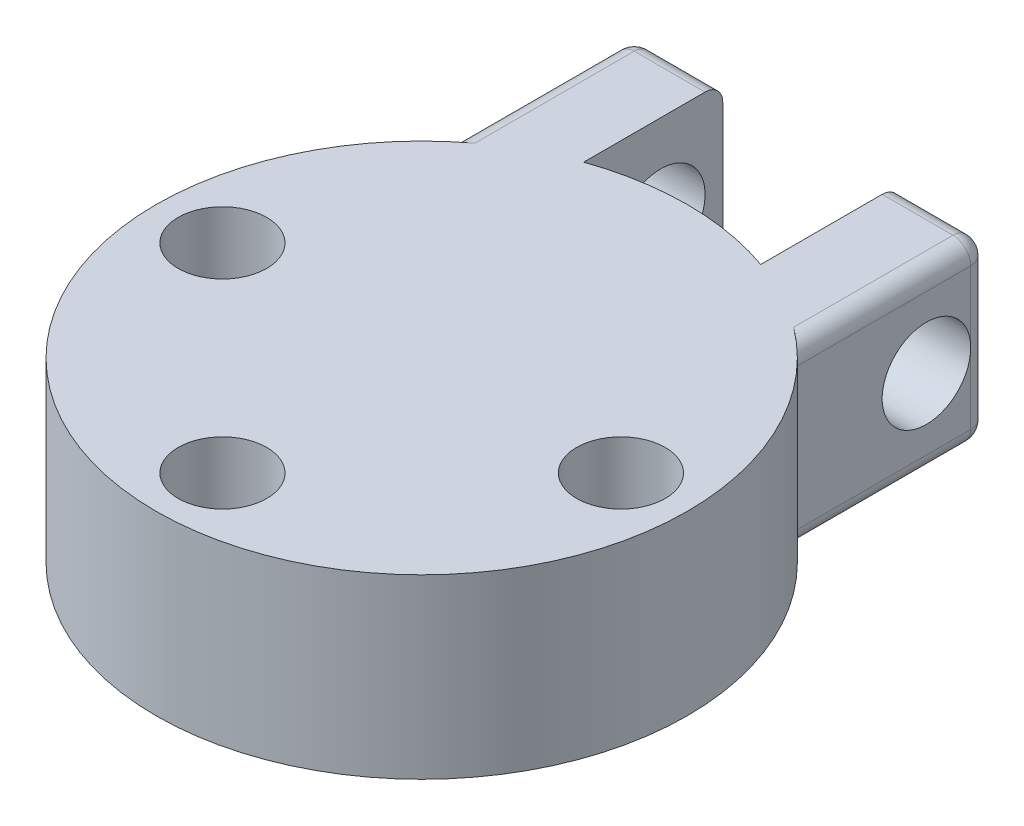
ISO-10303-21;
HEADER;
FILE_DESCRIPTION(('STEP AP214'),'2;1');
FILE_NAME('part.step','',(''),(''),'','','');
FILE_SCHEMA(('AUTOMOTIVE_DESIGN { 1 0 10303 214 1 1 1 1 }'));
ENDSEC;
DATA;
#1=APPLICATION_CONTEXT('core data for automotive mechanical design processes');
#2=APPLICATION_PROTOCOL_DEFINITION('international standard','automotive_design',2000,#1);
#3=PRODUCT_CONTEXT('',#1,'mechanical');
#4=PRODUCT('Part','Part','',(#3));
#5=PRODUCT_RELATED_PRODUCT_CATEGORY('part','',(#4));
#6=PRODUCT_DEFINITION_FORMATION('','',#4);
#7=PRODUCT_DEFINITION_CONTEXT('part definition',#1,'design');
#8=PRODUCT_DEFINITION('design','',#6,#7);
#9=PRODUCT_DEFINITION_SHAPE('','',#8);
#10=(LENGTH_UNIT() NAMED_UNIT(*) SI_UNIT(.MILLI.,.METRE.));
#11=(NAMED_UNIT(*) PLANE_ANGLE_UNIT() SI_UNIT($,.RADIAN.));
#12=(NAMED_UNIT(*) SI_UNIT($,.STERADIAN.) SOLID_ANGLE_UNIT());
#13=UNCERTAINTY_MEASURE_WITH_UNIT(LENGTH_MEASURE(1.E-05),#10,'distance_accuracy_value','');
#14=(GEOMETRIC_REPRESENTATION_CONTEXT(3) GLOBAL_UNCERTAINTY_ASSIGNED_CONTEXT((#13)) GLOBAL_UNIT_ASSIGNED_CONTEXT((#10,
#11,#12)) REPRESENTATION_CONTEXT('',''));
#15=CARTESIAN_POINT('',(0.,0.,0.));
#16=DIRECTION('',(0.,0.,1.));
#17=DIRECTION('',(1.,0.,0.));
#18=AXIS2_PLACEMENT_3D('',#15,#16,#17);
#19=CARTESIAN_POINT('',(0.,0.,0.));
#20=DIRECTION('',(0.,1.,0.));
#21=DIRECTION('',(0.,0.,1.));
#22=AXIS2_PLACEMENT_3D('',#19,#20,#21);
#23=PLANE('',#22);
#24=CARTESIAN_POINT('',(11.25,0.,0.));
#25=DIRECTION('',(0.,-1.,0.));
#26=DIRECTION('',(0.,0.,-1.));
#27=AXIS2_PLACEMENT_3D('',#24,#25,#26);
#28=CIRCLE('',#27,2.5);
#29=CARTESIAN_POINT('',(11.25,0.,-2.5));
#30=VERTEX_POINT('',#29);
#31=EDGE_CURVE('E771',#30,#30,#28,.T.);
#32=ORIENTED_EDGE('',*,*,#31,.F.);
#33=EDGE_LOOP('',(#32));
#34=FACE_BOUND('',#33,.T.);
#35=CARTESIAN_POINT('',(0.,0.,11.25));
#36=DIRECTION('',(0.,-1.,0.));
#37=DIRECTION('',(0.,0.,-1.));
#38=AXIS2_PLACEMENT_3D('',#35,#36,#37);
#39=CIRCLE('',#38,2.5);
#40=CARTESIAN_POINT('',(0.,0.,8.75));
#41=VERTEX_POINT('',#40);
#42=EDGE_CURVE('E773',#41,#41,#39,.T.);
#43=ORIENTED_EDGE('',*,*,#42,.F.);
#44=EDGE_LOOP('',(#43));
#45=FACE_BOUND('',#44,.T.);
#46=DIRECTION('',(0.,0.,-1.));
#47=VECTOR('',#46,1.);
#48=CARTESIAN_POINT('',(9.,0.,0.));
#49=LINE('',#48,#47);
#50=CARTESIAN_POINT('',(9.,0.,-21.));
#51=VERTEX_POINT('',#50);
#52=CARTESIAN_POINT('',(9.,0.,-12.));
#53=VERTEX_POINT('',#52);
#54=EDGE_CURVE('E490',#51,#53,#49,.F.);
#55=ORIENTED_EDGE('',*,*,#54,.T.);
#56=CARTESIAN_POINT('',(0.,0.,0.));
#57=DIRECTION('',(0.,1.,0.));
#58=DIRECTION('',(0.,0.,1.));
#59=AXIS2_PLACEMENT_3D('',#56,#57,#58);
#60=CIRCLE('',#59,15.);
#61=CARTESIAN_POINT('',(-9.,0.,-12.));
#62=VERTEX_POINT('',#61);
#63=EDGE_CURVE('E196',#62,#53,#60,.T.);
#64=ORIENTED_EDGE('',*,*,#63,.F.);
#65=DIRECTION('',(0.,0.,1.));
#66=VECTOR('',#65,1.);
#67=CARTESIAN_POINT('',(-9.,0.,0.));
#68=LINE('',#67,#66);
#69=CARTESIAN_POINT('',(-9.,0.,-21.));
#70=VERTEX_POINT('',#69);
#71=EDGE_CURVE('E482',#62,#70,#68,.F.);
#72=ORIENTED_EDGE('',*,*,#71,.T.);
#73=DIRECTION('',(-1.,0.,0.));
#74=VECTOR('',#73,1.);
#75=CARTESIAN_POINT('',(0.,0.,-21.));
#76=LINE('',#75,#74);
#77=CARTESIAN_POINT('',(-5.,0.,-21.));
#78=VERTEX_POINT('',#77);
#79=EDGE_CURVE('E485',#70,#78,#76,.F.);
#80=ORIENTED_EDGE('',*,*,#79,.T.);
#81=DIRECTION('',(0.,0.,-1.));
#82=VECTOR('',#81,1.);
#83=CARTESIAN_POINT('',(-5.,0.,-14.142135623731));
#84=LINE('',#83,#82);
#85=CARTESIAN_POINT('',(-5.,0.,-5.59016994374947));
#86=VERTEX_POINT('',#85);
#87=EDGE_CURVE('E210',#86,#78,#84,.T.);
#88=ORIENTED_EDGE('',*,*,#87,.F.);
#89=CARTESIAN_POINT('',(0.,0.,0.));
#90=DIRECTION('',(0.,-1.,0.));
#91=DIRECTION('',(0.,0.,-1.));
#92=AXIS2_PLACEMENT_3D('',#89,#90,#91);
#93=CIRCLE('',#92,7.5);
#94=CARTESIAN_POINT('',(5.,0.,-5.59016994374947));
#95=VERTEX_POINT('',#94);
#96=EDGE_CURVE('E200',#95,#86,#93,.T.);
#97=ORIENTED_EDGE('',*,*,#96,.F.);
#98=DIRECTION('',(0.,0.,1.));
#99=VECTOR('',#98,1.);
#100=CARTESIAN_POINT('',(5.,0.,-14.142135623731));
#101=LINE('',#100,#99);
#102=CARTESIAN_POINT('',(5.,0.,-21.));
#103=VERTEX_POINT('',#102);
#104=EDGE_CURVE('E183',#103,#95,#101,.T.);
#105=ORIENTED_EDGE('',*,*,#104,.F.);
#106=DIRECTION('',(-1.,0.,0.));
#107=VECTOR('',#106,1.);
#108=CARTESIAN_POINT('',(0.,0.,-21.));
#109=LINE('',#108,#107);
#110=EDGE_CURVE('E488',#103,#51,#109,.F.);
#111=ORIENTED_EDGE('',*,*,#110,.T.);
#112=EDGE_LOOP('',(#55,#64,#72,#80,#88,#97,#105,#111));
#113=FACE_BOUND('',#112,.T.);
#114=CARTESIAN_POINT('',(-11.25,0.,0.));
#115=DIRECTION('',(0.,-1.,0.));
#116=DIRECTION('',(0.,0.,-1.));
#117=AXIS2_PLACEMENT_3D('',#114,#115,#116);
#118=CIRCLE('',#117,2.5);
#119=CARTESIAN_POINT('',(-11.25,0.,-2.5));
#120=VERTEX_POINT('',#119);
#121=EDGE_CURVE('E780',#120,#120,#118,.T.);
#122=ORIENTED_EDGE('',*,*,#121,.F.);
#123=EDGE_LOOP('',(#122));
#124=FACE_BOUND('',#123,.T.);
#125=ADVANCED_FACE('F41',(#34,#45,#113,#124),#23,.F.);
#126=CARTESIAN_POINT('',(0.,10.,0.));
#127=DIRECTION('',(0.,-1.,0.));
#128=DIRECTION('',(0.,0.,-1.));
#129=AXIS2_PLACEMENT_3D('',#126,#127,#128);
#130=CYLINDRICAL_SURFACE('',#129,15.);
#131=DIRECTION('',(0.,-1.,0.));
#132=VECTOR('',#131,1.);
#133=CARTESIAN_POINT('',(5.,10.,-14.142135623731));
#134=LINE('',#133,#132);
#135=CARTESIAN_POINT('',(5.,10.,-14.142135623731));
#136=VERTEX_POINT('',#135);
#137=CARTESIAN_POINT('',(5.,9.5,-14.142135623731));
#138=VERTEX_POINT('',#137);
#139=EDGE_CURVE('E249',#136,#138,#134,.T.);
#140=ORIENTED_EDGE('',*,*,#139,.T.);
#141=CARTESIAN_POINT('',(0.,9.5,0.));
#142=DIRECTION('',(0.,1.,0.));
#143=DIRECTION('',(0.,0.,1.));
#144=AXIS2_PLACEMENT_3D('',#141,#142,#143);
#145=CIRCLE('',#144,15.);
#146=CARTESIAN_POINT('',(-5.,9.5,-14.142135623731));
#147=VERTEX_POINT('',#146);
#148=EDGE_CURVE('E268',#138,#147,#145,.T.);
#149=ORIENTED_EDGE('',*,*,#148,.T.);
#150=DIRECTION('',(0.,-1.,0.));
#151=VECTOR('',#150,1.);
#152=CARTESIAN_POINT('',(-5.,10.,-14.142135623731));
#153=LINE('',#152,#151);
#154=CARTESIAN_POINT('',(-5.,10.,-14.142135623731));
#155=VERTEX_POINT('',#154);
#156=EDGE_CURVE('E265',#155,#147,#153,.T.);
#157=ORIENTED_EDGE('',*,*,#156,.F.);
#158=CARTESIAN_POINT('',(0.,10.,0.));
#159=DIRECTION('',(0.,1.,0.));
#160=DIRECTION('',(0.,0.,1.));
#161=AXIS2_PLACEMENT_3D('',#158,#159,#160);
#162=CIRCLE('',#161,15.);
#163=EDGE_CURVE('E195',#136,#155,#162,.T.);
#164=ORIENTED_EDGE('',*,*,#163,.F.);
#165=EDGE_LOOP('',(#140,#149,#157,#164));
#166=FACE_BOUND('',#165,.T.);
#167=ADVANCED_FACE('F303',(#166),#130,.T.);
#168=CARTESIAN_POINT('',(-5.,10.,-14.142135623731));
#169=DIRECTION('',(-1.,0.,0.));
#170=DIRECTION('',(0.,0.,1.));
#171=AXIS2_PLACEMENT_3D('',#168,#169,#170);
#172=PLANE('',#171);
#173=CARTESIAN_POINT('',(-5.,5.,-18.5));
#174=DIRECTION('',(-1.,0.,0.));
#175=DIRECTION('',(0.,0.,1.));
#176=AXIS2_PLACEMENT_3D('',#173,#174,#175);
#177=CIRCLE('',#176,2.5);
#178=CARTESIAN_POINT('',(-5.,5.,-16.));
#179=VERTEX_POINT('',#178);
#180=EDGE_CURVE('E237',#179,#179,#177,.T.);
#181=ORIENTED_EDGE('',*,*,#180,.T.);
#182=EDGE_LOOP('',(#181));
#183=FACE_BOUND('',#182,.T.);
#184=ORIENTED_EDGE('',*,*,#87,.T.);
#185=CARTESIAN_POINT('',(-5.,0.999999999999999,-21.));
#186=DIRECTION('',(-1.,0.,0.));
#187=DIRECTION('',(0.,0.,1.));
#188=AXIS2_PLACEMENT_3D('',#185,#186,#187);
#189=CIRCLE('',#188,1.);
#190=CARTESIAN_POINT('',(-5.,0.999999999999999,-22.));
#191=VERTEX_POINT('',#190);
#192=EDGE_CURVE('E471',#78,#191,#189,.F.);
#193=ORIENTED_EDGE('',*,*,#192,.T.);
#194=DIRECTION('',(0.,-1.,0.));
#195=VECTOR('',#194,1.);
#196=CARTESIAN_POINT('',(-5.,10.,-22.));
#197=LINE('',#196,#195);
#198=CARTESIAN_POINT('',(-5.,9.,-22.));
#199=VERTEX_POINT('',#198);
#200=EDGE_CURVE('E262',#199,#191,#197,.T.);
#201=ORIENTED_EDGE('',*,*,#200,.F.);
#202=CARTESIAN_POINT('',(-5.,9.,-21.));
#203=DIRECTION('',(-1.,0.,0.));
#204=DIRECTION('',(0.,0.,1.));
#205=AXIS2_PLACEMENT_3D('',#202,#203,#204);
#206=CIRCLE('',#205,1.);
#207=CARTESIAN_POINT('',(-5.,10.,-21.));
#208=VERTEX_POINT('',#207);
#209=EDGE_CURVE('E514',#199,#208,#206,.F.);
#210=ORIENTED_EDGE('',*,*,#209,.T.);
#211=DIRECTION('',(0.,0.,-1.));
#212=VECTOR('',#211,1.);
#213=CARTESIAN_POINT('',(-5.,10.,-14.142135623731));
#214=LINE('',#213,#212);
#215=EDGE_CURVE('E242',#155,#208,#214,.T.);
#216=ORIENTED_EDGE('',*,*,#215,.F.);
#217=ORIENTED_EDGE('',*,*,#156,.T.);
#218=CARTESIAN_POINT('',(-5.,9.5,-14.142135623731));
#219=CARTESIAN_POINT('',(-5.,9.3324654449293,-13.9644362529883));
#220=CARTESIAN_POINT('',(-5.,9.16511441299039,-13.7865636565365));
#221=CARTESIAN_POINT('',(-5.,8.83082894329499,-13.4304297689544));
#222=CARTESIAN_POINT('',(-5.,8.66389450267688,-13.2521684805099));
#223=CARTESIAN_POINT('',(-5.,8.33048922486681,-12.895212273305));
#224=CARTESIAN_POINT('',(-5.,8.16401838831296,-12.7165173539483));
#225=CARTESIAN_POINT('',(-5.,7.83160064461413,-12.3586386171312));
#226=CARTESIAN_POINT('',(-5.,7.66565374108889,-12.1794547963089));
#227=CARTESIAN_POINT('',(-5.,7.5,-12.));
#228=B_SPLINE_CURVE_WITH_KNOTS('',3,(#218,#219,#220,#221,#222,#223,#224,#225,#226,#227),
.UNSPECIFIED.,.F.,.F.,(4,2,2,2,4),(0.,0.732669199428463,1.4653333521281,2.19799851277881,
2.9306687242239),.UNSPECIFIED.);
#229=CARTESIAN_POINT('',(-5.,7.5,-12.));
#230=VERTEX_POINT('',#229);
#231=EDGE_CURVE('E275',#147,#230,#228,.T.);
#232=ORIENTED_EDGE('',*,*,#231,.T.);
#233=DIRECTION('',(0.,0.,-1.));
#234=VECTOR('',#233,1.);
#235=CARTESIAN_POINT('',(-5.,7.5,-2.));
#236=LINE('',#235,#234);
#237=CARTESIAN_POINT('',(-5.,7.5,-5.59016994374948));
#238=VERTEX_POINT('',#237);
#239=EDGE_CURVE('E222',#238,#230,#236,.T.);
#240=ORIENTED_EDGE('',*,*,#239,.F.);
#241=DIRECTION('',(0.,-1.,0.));
#242=VECTOR('',#241,1.);
#243=CARTESIAN_POINT('',(-5.,28.7132034355964,-5.59016994374947));
#244=LINE('',#243,#242);
#245=EDGE_CURVE('E204',#238,#86,#244,.T.);
#246=ORIENTED_EDGE('',*,*,#245,.T.);
#247=EDGE_LOOP('',(#184,#193,#201,#210,#216,#217,#232,#240,#246));
#248=FACE_BOUND('',#247,.T.);
#249=ADVANCED_FACE('F290',(#183,#248),#172,.F.);
#250=CARTESIAN_POINT('',(-5.,10.,-22.));
#251=DIRECTION('',(0.,0.,1.));
#252=DIRECTION('',(1.,0.,0.));
#253=AXIS2_PLACEMENT_3D('',#250,#251,#252);
#254=PLANE('',#253);
#255=ORIENTED_EDGE('',*,*,#200,.T.);
#256=DIRECTION('',(-1.,0.,0.));
#257=VECTOR('',#256,1.);
#258=CARTESIAN_POINT('',(-5.,0.999999999999999,-22.));
#259=LINE('',#258,#257);
#260=CARTESIAN_POINT('',(-9.,0.999999999999999,-22.));
#261=VERTEX_POINT('',#260);
#262=EDGE_CURVE('E512',#191,#261,#259,.T.);
#263=ORIENTED_EDGE('',*,*,#262,.T.);
#264=DIRECTION('',(0.,-1.,0.));
#265=VECTOR('',#264,1.);
#266=CARTESIAN_POINT('',(-9.,10.,-22.));
#267=LINE('',#266,#265);
#268=CARTESIAN_POINT('',(-9.,9.,-22.));
#269=VERTEX_POINT('',#268);
#270=EDGE_CURVE('E464',#261,#269,#267,.F.);
#271=ORIENTED_EDGE('',*,*,#270,.T.);
#272=DIRECTION('',(-1.,0.,0.));
#273=VECTOR('',#272,1.);
#274=CARTESIAN_POINT('',(-5.,9.,-22.));
#275=LINE('',#274,#273);
#276=EDGE_CURVE('E509',#269,#199,#275,.F.);
#277=ORIENTED_EDGE('',*,*,#276,.T.);
#278=EDGE_LOOP('',(#255,#263,#271,#277));
#279=FACE_BOUND('',#278,.T.);
#280=ADVANCED_FACE('F519',(#279),#254,.F.);
#281=CARTESIAN_POINT('',(-10.,10.,-22.));
#282=DIRECTION('',(1.,0.,0.));
#283=DIRECTION('',(0.,0.,-1.));
#284=AXIS2_PLACEMENT_3D('',#281,#282,#283);
#285=PLANE('',#284);
#286=DIRECTION('',(0.,-1.,0.));
#287=VECTOR('',#286,1.);
#288=CARTESIAN_POINT('',(-10.,10.,-21.));
#289=LINE('',#288,#287);
#290=CARTESIAN_POINT('',(-10.,4.64556382803104,-21.));
#291=VERTEX_POINT('',#290);
#292=CARTESIAN_POINT('',(-10.,0.999999999999999,-21.));
#293=VERTEX_POINT('',#292);
#294=EDGE_CURVE('E58',#291,#293,#289,.T.);
#295=ORIENTED_EDGE('',*,*,#294,.T.);
#296=DIRECTION('',(0.,0.,1.));
#297=VECTOR('',#296,1.);
#298=CARTESIAN_POINT('',(-10.,0.999999999999999,-22.));
#299=LINE('',#298,#297);
#300=CARTESIAN_POINT('',(-10.,0.999999999999999,-11.1803398874989));
#301=VERTEX_POINT('',#300);
#302=EDGE_CURVE('E469',#293,#301,#299,.T.);
#303=ORIENTED_EDGE('',*,*,#302,.T.);
#304=DIRECTION('',(0.,-1.,0.));
#305=VECTOR('',#304,1.);
#306=CARTESIAN_POINT('',(-10.,10.,-11.1803398874989));
#307=LINE('',#306,#305);
#308=CARTESIAN_POINT('',(-10.,9.,-11.1803398874989));
#309=VERTEX_POINT('',#308);
#310=EDGE_CURVE('E259',#309,#301,#307,.T.);
#311=ORIENTED_EDGE('',*,*,#310,.F.);
#312=DIRECTION('',(0.,0.,1.));
#313=VECTOR('',#312,1.);
#314=CARTESIAN_POINT('',(-10.,9.,-22.));
#315=LINE('',#314,#313);
#316=CARTESIAN_POINT('',(-10.,9.,-21.));
#317=VERTEX_POINT('',#316);
#318=EDGE_CURVE('E65',#309,#317,#315,.F.);
#319=ORIENTED_EDGE('',*,*,#318,.T.);
#320=DIRECTION('',(0.,-1.,0.));
#321=VECTOR('',#320,1.);
#322=CARTESIAN_POINT('',(-10.,10.,-21.));
#323=LINE('',#322,#321);
#324=CARTESIAN_POINT('',(-10.,5.35443617196896,-21.));
#325=VERTEX_POINT('',#324);
#326=EDGE_CURVE('E467',#317,#325,#323,.T.);
#327=ORIENTED_EDGE('',*,*,#326,.T.);
#328=CARTESIAN_POINT('',(-10.,5.,-18.5));
#329=DIRECTION('',(-1.,0.,0.));
#330=DIRECTION('',(0.,0.,1.));
#331=AXIS2_PLACEMENT_3D('',#328,#329,#330);
#332=CIRCLE('',#331,2.525);
#333=EDGE_CURVE('E225',#291,#325,#332,.T.);
#334=ORIENTED_EDGE('',*,*,#333,.F.);
#335=EDGE_LOOP('',(#295,#303,#311,#319,#327,#334));
#336=FACE_BOUND('',#335,.T.);
#337=ADVANCED_FACE('F342',(#336),#285,.F.);
#338=CARTESIAN_POINT('',(0.,10.,0.));
#339=DIRECTION('',(0.,-1.,0.));
#340=DIRECTION('',(0.,0.,-1.));
#341=AXIS2_PLACEMENT_3D('',#338,#339,#340);
#342=CYLINDRICAL_SURFACE('',#341,15.);
#343=ORIENTED_EDGE('',*,*,#63,.T.);
#344=CARTESIAN_POINT('',(9.,0.,-12.));
#345=CARTESIAN_POINT('',(9.03377321049992,5.63577839048266E-06,-11.9746711292854));
#346=CARTESIAN_POINT('',(9.0674207157014,0.00171115546372185,-11.949211413127));
#347=CARTESIAN_POINT('',(9.13429039608225,0.00848668643400343,-11.898172355381));
#348=CARTESIAN_POINT('',(9.16751251821453,0.0135571132514013,-11.8725929994065));
#349=CARTESIAN_POINT('',(9.26683354761349,0.0338780284921263,-11.7954583755289));
#350=CARTESIAN_POINT('',(9.33199994076715,0.0542373260912627,-11.7439472545075));
#351=CARTESIAN_POINT('',(9.46048284659745,0.109467698611544,-11.6407186978458));
#352=CARTESIAN_POINT('',(9.52362493299514,0.144879633062461,-11.5890733064646));
#353=CARTESIAN_POINT('',(9.64274047483934,0.230438259967545,-11.4901475953926));
#354=CARTESIAN_POINT('',(9.69874291326769,0.280522467680784,-11.4428498602015));
#355=CARTESIAN_POINT('',(9.78137593836556,0.374089367370318,-11.3721794328137));
#356=CARTESIAN_POINT('',(9.8111624603275,0.413045959840131,-11.3464706944544));
#357=CARTESIAN_POINT('',(9.86555255396907,0.496712424049257,-11.2992107098598));
#358=CARTESIAN_POINT('',(9.89016236453539,0.541415264552763,-11.2776544617832));
#359=CARTESIAN_POINT('',(9.92928674810786,0.628115746479882,-11.2432126869275));
#360=CARTESIAN_POINT('',(9.9447999352213,0.669324563470285,-11.2294810755984));
#361=CARTESIAN_POINT('',(9.97043679500841,0.754595317951445,-11.2067250646297));
#362=CARTESIAN_POINT('',(9.98057099099719,0.798651494006977,-11.1976914746109));
#363=CARTESIAN_POINT('',(9.991754902862,0.869227559030954,-11.18771036849));
#364=CARTESIAN_POINT('',(9.99483615245806,0.895192375202766,-11.1849569955348));
#365=CARTESIAN_POINT('',(9.99896246510907,0.947432032282131,-11.1812679189395));
#366=CARTESIAN_POINT('',(10.0000058468649,0.973707111202459,-11.1803337161687));
#367=CARTESIAN_POINT('',(10.,1.,-11.1803398874989));
#368=B_SPLINE_CURVE_WITH_KNOTS('',3,(#344,#345,#346,#347,#348,#349,#350,#351,#352,#353,#354,
#355,#356,#357,#358,#359,#360,#361,#362,#363,#364,#365,#366,#367),.UNSPECIFIED.,.F.,.F.,(4,2,2,
2,2,2,2,2,2,2,2,4),(0.,0.126570579409867,0.25315679193228,0.508506457475154,0.773930758346642,
1.03824073463594,1.2037888606925,1.36913631308338,1.50695373012387,1.64450052166439,
1.72324405117177,1.80205251894319),.UNSPECIFIED.);
#369=CARTESIAN_POINT('',(10.,0.999999999999999,-11.1803398874989));
#370=VERTEX_POINT('',#369);
#371=EDGE_CURVE('E313',#53,#370,#368,.T.);
#372=ORIENTED_EDGE('',*,*,#371,.T.);
#373=DIRECTION('',(0.,-1.,0.));
#374=VECTOR('',#373,1.);
#375=CARTESIAN_POINT('',(10.,10.,-11.1803398874989));
#376=LINE('',#375,#374);
#377=CARTESIAN_POINT('',(10.,9.,-11.1803398874989));
#378=VERTEX_POINT('',#377);
#379=EDGE_CURVE('E256',#378,#370,#376,.T.);
#380=ORIENTED_EDGE('',*,*,#379,.F.);
#381=CARTESIAN_POINT('',(10.,9.,-11.1803398874989));
#382=CARTESIAN_POINT('',(10.0000028251789,9.02329856039248,-11.180336827071));
#383=CARTESIAN_POINT('',(9.99918509162398,9.0465831538506,-11.181068808798));
#384=CARTESIAN_POINT('',(9.99594273299848,9.09293374392143,-11.1839678171905));
#385=CARTESIAN_POINT('',(9.99351927010286,9.1159998864041,-11.1861338059671));
#386=CARTESIAN_POINT('',(9.98394602053097,9.18423459643453,-11.1946816742628));
#387=CARTESIAN_POINT('',(9.97449200346692,9.22885365508113,-11.203114825231));
#388=CARTESIAN_POINT('',(9.95010325845555,9.31514364021058,-11.2247808335112));
#389=CARTESIAN_POINT('',(9.93518239931415,9.35682171134586,-11.2380015443061));
#390=CARTESIAN_POINT('',(9.90065988388437,9.43670404801112,-11.2684277817146));
#391=CARTESIAN_POINT('',(9.88104830114859,9.47490070623029,-11.2856417564623));
#392=CARTESIAN_POINT('',(9.82995938219926,9.56081044719142,-11.330199654828));
#393=CARTESIAN_POINT('',(9.79678002383564,9.60679099753027,-11.3589316395447));
#394=CARTESIAN_POINT('',(9.72492821114227,9.6910549417367,-11.4205088196237));
#395=CARTESIAN_POINT('',(9.68624623616454,9.72932471111231,-11.4533611320844));
#396=CARTESIAN_POINT('',(9.59356727149628,9.80764978533431,-11.5311770476264));
#397=CARTESIAN_POINT('',(9.53827697731161,9.84532470588148,-11.5769938044048));
#398=CARTESIAN_POINT('',(9.42300423305503,9.90851064507289,-11.6710128818719));
#399=CARTESIAN_POINT('',(9.36301845730374,9.93401294977316,-11.7192168843403));
#400=CARTESIAN_POINT('',(9.25262141208705,9.96892245268419,-11.8064757939811));
#401=CARTESIAN_POINT('',(9.20277677209299,9.98056058978492,-11.8453744828662));
#402=CARTESIAN_POINT('',(9.10204158316749,9.99607440156348,-11.9229579066036));
#403=CARTESIAN_POINT('',(9.05115580121067,9.99997979674471,-11.9616428885192));
#404=CARTESIAN_POINT('',(9.,10.,-12.));
#405=B_SPLINE_CURVE_WITH_KNOTS('',3,(#381,#382,#383,#384,#385,#386,#387,#388,#389,#390,#391,
#392,#393,#394,#395,#396,#397,#398,#399,#400,#401,#402,#403,#404),.UNSPECIFIED.,.F.,.F.,(4,2,2,
2,2,2,2,2,2,2,2,4),(0.,0.0698433655008459,0.139636235771019,0.277998347041824,0.416011851422552,
0.554320043275716,0.743982423243321,0.933977041893936,1.17599531421024,1.41818657994564,
1.61059186594375,1.8022562027838),.UNSPECIFIED.);
#406=CARTESIAN_POINT('',(9.,10.,-12.));
#407=VERTEX_POINT('',#406);
#408=EDGE_CURVE('E321',#378,#407,#405,.T.);
#409=ORIENTED_EDGE('',*,*,#408,.T.);
#410=CARTESIAN_POINT('',(0.,10.,0.));
#411=DIRECTION('',(0.,1.,0.));
#412=DIRECTION('',(0.,0.,1.));
#413=AXIS2_PLACEMENT_3D('',#410,#411,#412);
#414=CIRCLE('',#413,15.);
#415=CARTESIAN_POINT('',(-9.,10.,-12.));
#416=VERTEX_POINT('',#415);
#417=EDGE_CURVE('E245',#416,#407,#414,.T.);
#418=ORIENTED_EDGE('',*,*,#417,.F.);
#419=CARTESIAN_POINT('',(-9.,10.,-12.));
#420=CARTESIAN_POINT('',(-9.03377321049992,9.99999436422161,-11.9746711292854));
#421=CARTESIAN_POINT('',(-9.0674207157014,9.99828884453628,-11.949211413127));
#422=CARTESIAN_POINT('',(-9.13429039608225,9.991513313566,-11.898172355381));
#423=CARTESIAN_POINT('',(-9.16751251821453,9.9864428867486,-11.8725929994065));
#424=CARTESIAN_POINT('',(-9.2668335476135,9.96612197150788,-11.7954583755289));
#425=CARTESIAN_POINT('',(-9.33199994076715,9.94576267390874,-11.7439472545075));
#426=CARTESIAN_POINT('',(-9.46048284659745,9.89053230138846,-11.6407186978458));
#427=CARTESIAN_POINT('',(-9.52362493299514,9.85512036693754,-11.5890733064646));
#428=CARTESIAN_POINT('',(-9.64274047483934,9.76956174003245,-11.4901475953926));
#429=CARTESIAN_POINT('',(-9.69874291326769,9.71947753231922,-11.4428498602015));
#430=CARTESIAN_POINT('',(-9.78137593836556,9.62591063262968,-11.3721794328137));
#431=CARTESIAN_POINT('',(-9.8111624603275,9.58695404015987,-11.3464706944544));
#432=CARTESIAN_POINT('',(-9.86555255396907,9.50328757595074,-11.2992107098598));
#433=CARTESIAN_POINT('',(-9.89016236453539,9.45858473544724,-11.2776544617832));
#434=CARTESIAN_POINT('',(-9.92928674810786,9.37188425352012,-11.2432126869275));
#435=CARTESIAN_POINT('',(-9.9447999352213,9.33067543652971,-11.2294810755984));
#436=CARTESIAN_POINT('',(-9.97043679500841,9.24540468204856,-11.2067250646297));
#437=CARTESIAN_POINT('',(-9.98057099099719,9.20134850599302,-11.1976914746109));
#438=CARTESIAN_POINT('',(-9.991754902862,9.13077244096904,-11.18771036849));
#439=CARTESIAN_POINT('',(-9.99483615245806,9.10480762479723,-11.1849569955348));
#440=CARTESIAN_POINT('',(-9.99896246510907,9.05256796771787,-11.1812679189395));
#441=CARTESIAN_POINT('',(-10.0000058468649,9.02629288879754,-11.1803337161687));
#442=CARTESIAN_POINT('',(-10.,9.,-11.1803398874989));
#443=B_SPLINE_CURVE_WITH_KNOTS('',3,(#419,#420,#421,#422,#423,#424,#425,#426,#427,#428,#429,
#430,#431,#432,#433,#434,#435,#436,#437,#438,#439,#440,#441,#442),.UNSPECIFIED.,.F.,.F.,(4,2,2,
2,2,2,2,2,2,2,2,4),(0.,0.126570579409867,0.253156791932281,0.508506457475154,0.77393075834664,
1.03824073463594,1.2037888606925,1.36913631308338,1.50695373012387,1.64450052166439,
1.72324405117177,1.80205251894319),.UNSPECIFIED.);
#444=EDGE_CURVE('E11',#416,#309,#443,.T.);
#445=ORIENTED_EDGE('',*,*,#444,.T.);
#446=ORIENTED_EDGE('',*,*,#310,.T.);
#447=CARTESIAN_POINT('',(-10.,0.999999999999999,-11.1803398874989));
#448=CARTESIAN_POINT('',(-10.0000028251789,0.976701439607516,-11.180336827071));
#449=CARTESIAN_POINT('',(-9.99918509162398,0.953416846149402,-11.181068808798));
#450=CARTESIAN_POINT('',(-9.99594273299848,0.907066256078569,-11.1839678171905));
#451=CARTESIAN_POINT('',(-9.99351927010286,0.884000113595894,-11.1861338059671));
#452=CARTESIAN_POINT('',(-9.98394602053097,0.815765403565473,-11.1946816742628));
#453=CARTESIAN_POINT('',(-9.97449200346692,0.771146344918872,-11.203114825231));
#454=CARTESIAN_POINT('',(-9.95010325845555,0.684856359789424,-11.2247808335112));
#455=CARTESIAN_POINT('',(-9.93518239931415,0.643178288654145,-11.2380015443061));
#456=CARTESIAN_POINT('',(-9.90065988388437,0.563295951988885,-11.2684277817146));
#457=CARTESIAN_POINT('',(-9.88104830114859,0.525099293769716,-11.2856417564623));
#458=CARTESIAN_POINT('',(-9.82995938219926,0.439189552808576,-11.330199654828));
#459=CARTESIAN_POINT('',(-9.79678002383564,0.393209002469732,-11.3589316395447));
#460=CARTESIAN_POINT('',(-9.72492821114227,0.308945058263296,-11.4205088196237));
#461=CARTESIAN_POINT('',(-9.68624623616454,0.270675288887692,-11.4533611320844));
#462=CARTESIAN_POINT('',(-9.59356727149628,0.192350214665685,-11.5311770476264));
#463=CARTESIAN_POINT('',(-9.53827697731161,0.154675294118518,-11.5769938044048));
#464=CARTESIAN_POINT('',(-9.42300423305503,0.0914893549271094,-11.6710128818719));
#465=CARTESIAN_POINT('',(-9.36301845730374,0.0659870502268382,-11.7192168843403));
#466=CARTESIAN_POINT('',(-9.25262141208705,0.0310775473158066,-11.8064757939811));
#467=CARTESIAN_POINT('',(-9.20277677209299,0.0194394102150837,-11.8453744828662));
#468=CARTESIAN_POINT('',(-9.10204158316749,0.00392559843651494,-11.9229579066036));
#469=CARTESIAN_POINT('',(-9.05115580121067,2.02032552860571E-05,-11.9616428885192));
#470=CARTESIAN_POINT('',(-9.,0.,-12.));
#471=B_SPLINE_CURVE_WITH_KNOTS('',3,(#447,#448,#449,#450,#451,#452,#453,#454,#455,#456,#457,
#458,#459,#460,#461,#462,#463,#464,#465,#466,#467,#468,#469,#470),.UNSPECIFIED.,.F.,.F.,(4,2,2,
2,2,2,2,2,2,2,2,4),(0.,0.069843365500848,0.139636235771021,0.277998347041823,0.416011851422551,
0.554320043275716,0.743982423243321,0.933977041893936,1.17599531421024,1.41818657994564,
1.61059186594376,1.8022562027838),.UNSPECIFIED.);
#472=EDGE_CURVE('E50',#301,#62,#471,.T.);
#473=ORIENTED_EDGE('',*,*,#472,.T.);
#474=EDGE_LOOP('',(#343,#372,#380,#409,#418,#445,#446,#473));
#475=FACE_BOUND('',#474,.T.);
#476=ADVANCED_FACE('F336',(#475),#342,.T.);
#477=CARTESIAN_POINT('',(10.,10.,-22.));
#478=DIRECTION('',(-1.,0.,0.));
#479=DIRECTION('',(0.,0.,1.));
#480=AXIS2_PLACEMENT_3D('',#477,#478,#479);
#481=PLANE('',#480);
#482=ORIENTED_EDGE('',*,*,#379,.T.);
#483=DIRECTION('',(0.,0.,-1.));
#484=VECTOR('',#483,1.);
#485=CARTESIAN_POINT('',(10.,0.999999999999999,-22.));
#486=LINE('',#485,#484);
#487=CARTESIAN_POINT('',(10.,0.999999999999999,-21.));
#488=VERTEX_POINT('',#487);
#489=EDGE_CURVE('E492',#370,#488,#486,.T.);
#490=ORIENTED_EDGE('',*,*,#489,.T.);
#491=DIRECTION('',(0.,-1.,0.));
#492=VECTOR('',#491,1.);
#493=CARTESIAN_POINT('',(10.,10.,-21.));
#494=LINE('',#493,#492);
#495=CARTESIAN_POINT('',(10.,5.,-21.));
#496=VERTEX_POINT('',#495);
#497=EDGE_CURVE('E432',#488,#496,#494,.F.);
#498=ORIENTED_EDGE('',*,*,#497,.T.);
#499=CARTESIAN_POINT('',(10.,5.,-18.5));
#500=DIRECTION('',(-1.,0.,0.));
#501=DIRECTION('',(0.,0.,1.));
#502=AXIS2_PLACEMENT_3D('',#499,#500,#501);
#503=CIRCLE('',#502,2.5);
#504=EDGE_CURVE('E234',#496,#496,#503,.T.);
#505=ORIENTED_EDGE('',*,*,#504,.T.);
#506=DIRECTION('',(0.,-1.,0.));
#507=VECTOR('',#506,1.);
#508=CARTESIAN_POINT('',(10.,10.,-21.));
#509=LINE('',#508,#507);
#510=CARTESIAN_POINT('',(10.,9.,-21.));
#511=VERTEX_POINT('',#510);
#512=EDGE_CURVE('E533',#496,#511,#509,.F.);
#513=ORIENTED_EDGE('',*,*,#512,.T.);
#514=DIRECTION('',(0.,0.,-1.));
#515=VECTOR('',#514,1.);
#516=CARTESIAN_POINT('',(10.,9.,-11.1803398874989));
#517=LINE('',#516,#515);
#518=EDGE_CURVE('E532',#511,#378,#517,.F.);
#519=ORIENTED_EDGE('',*,*,#518,.T.);
#520=EDGE_LOOP('',(#482,#490,#498,#505,#513,#519));
#521=FACE_BOUND('',#520,.T.);
#522=ADVANCED_FACE('F341',(#521),#481,.F.);
#523=CARTESIAN_POINT('',(5.,10.,-22.));
#524=DIRECTION('',(0.,0.,1.));
#525=DIRECTION('',(1.,0.,0.));
#526=AXIS2_PLACEMENT_3D('',#523,#524,#525);
#527=PLANE('',#526);
#528=DIRECTION('',(0.,-1.,0.));
#529=VECTOR('',#528,1.);
#530=CARTESIAN_POINT('',(9.,10.,-22.));
#531=LINE('',#530,#529);
#532=CARTESIAN_POINT('',(9.,9.,-22.));
#533=VERTEX_POINT('',#532);
#534=CARTESIAN_POINT('',(9.,0.999999999999999,-22.));
#535=VERTEX_POINT('',#534);
#536=EDGE_CURVE('E408',#533,#535,#531,.T.);
#537=ORIENTED_EDGE('',*,*,#536,.T.);
#538=DIRECTION('',(-1.,0.,0.));
#539=VECTOR('',#538,1.);
#540=CARTESIAN_POINT('',(5.,0.999999999999999,-22.));
#541=LINE('',#540,#539);
#542=CARTESIAN_POINT('',(5.,0.999999999999999,-22.));
#543=VERTEX_POINT('',#542);
#544=EDGE_CURVE('E411',#535,#543,#541,.T.);
#545=ORIENTED_EDGE('',*,*,#544,.T.);
#546=DIRECTION('',(0.,-1.,0.));
#547=VECTOR('',#546,1.);
#548=CARTESIAN_POINT('',(5.,10.,-22.));
#549=LINE('',#548,#547);
#550=CARTESIAN_POINT('',(5.,9.,-22.));
#551=VERTEX_POINT('',#550);
#552=EDGE_CURVE('E254',#551,#543,#549,.T.);
#553=ORIENTED_EDGE('',*,*,#552,.F.);
#554=DIRECTION('',(-1.,0.,0.));
#555=VECTOR('',#554,1.);
#556=CARTESIAN_POINT('',(10.,9.,-22.));
#557=LINE('',#556,#555);
#558=EDGE_CURVE('E413',#551,#533,#557,.F.);
#559=ORIENTED_EDGE('',*,*,#558,.T.);
#560=EDGE_LOOP('',(#537,#545,#553,#559));
#561=FACE_BOUND('',#560,.T.);
#562=ADVANCED_FACE('F399',(#561),#527,.F.);
#563=CARTESIAN_POINT('',(5.,10.,-14.142135623731));
#564=DIRECTION('',(1.,0.,0.));
#565=DIRECTION('',(0.,0.,-1.));
#566=AXIS2_PLACEMENT_3D('',#563,#564,#565);
#567=PLANE('',#566);
#568=CARTESIAN_POINT('',(5.,5.,-18.5));
#569=DIRECTION('',(1.,0.,0.));
#570=DIRECTION('',(0.,0.,-1.));
#571=AXIS2_PLACEMENT_3D('',#568,#569,#570);
#572=CIRCLE('',#571,2.5);
#573=CARTESIAN_POINT('',(5.,5.,-21.));
#574=VERTEX_POINT('',#573);
#575=EDGE_CURVE('E233',#574,#574,#572,.T.);
#576=ORIENTED_EDGE('',*,*,#575,.T.);
#577=EDGE_LOOP('',(#576));
#578=FACE_BOUND('',#577,.T.);
#579=ORIENTED_EDGE('',*,*,#552,.T.);
#580=CARTESIAN_POINT('',(5.,0.999999999999999,-21.));
#581=DIRECTION('',(1.,0.,0.));
#582=DIRECTION('',(0.,0.,-1.));
#583=AXIS2_PLACEMENT_3D('',#580,#581,#582);
#584=CIRCLE('',#583,1.);
#585=EDGE_CURVE('E191',#543,#103,#584,.F.);
#586=ORIENTED_EDGE('',*,*,#585,.T.);
#587=ORIENTED_EDGE('',*,*,#104,.T.);
#588=DIRECTION('',(0.,-1.,0.));
#589=VECTOR('',#588,1.);
#590=CARTESIAN_POINT('',(5.,28.7132034355964,-5.59016994374947));
#591=LINE('',#590,#589);
#592=CARTESIAN_POINT('',(5.,7.5,-5.59016994374947));
#593=VERTEX_POINT('',#592);
#594=EDGE_CURVE('E188',#95,#593,#591,.F.);
#595=ORIENTED_EDGE('',*,*,#594,.T.);
#596=DIRECTION('',(0.,0.,-1.));
#597=VECTOR('',#596,1.);
#598=CARTESIAN_POINT('',(5.,7.5,-2.));
#599=LINE('',#598,#597);
#600=CARTESIAN_POINT('',(5.,7.5,-12.));
#601=VERTEX_POINT('',#600);
#602=EDGE_CURVE('E223',#593,#601,#599,.T.);
#603=ORIENTED_EDGE('',*,*,#602,.T.);
#604=CARTESIAN_POINT('',(5.,7.5,-12.));
#605=CARTESIAN_POINT('',(5.,7.66565374108889,-12.1794547963089));
#606=CARTESIAN_POINT('',(5.,7.83160064461413,-12.3586386171312));
#607=CARTESIAN_POINT('',(5.,8.16401838831296,-12.7165173539483));
#608=CARTESIAN_POINT('',(5.,8.33048922486681,-12.895212273305));
#609=CARTESIAN_POINT('',(5.,8.66389450267688,-13.2521684805099));
#610=CARTESIAN_POINT('',(5.,8.83082894329499,-13.4304297689544));
#611=CARTESIAN_POINT('',(5.,9.16511441299039,-13.7865636565365));
#612=CARTESIAN_POINT('',(5.,9.3324654449293,-13.9644362529883));
#613=CARTESIAN_POINT('',(5.,9.5,-14.142135623731));
#614=B_SPLINE_CURVE_WITH_KNOTS('',3,(#604,#605,#606,#607,#608,#609,#610,#611,#612,#613),
.UNSPECIFIED.,.F.,.F.,(4,2,2,2,4),(0.,0.732670211445103,1.46533537209581,2.19799952479544,
2.93066872422391),.UNSPECIFIED.);
#615=EDGE_CURVE('E283',#601,#138,#614,.T.);
#616=ORIENTED_EDGE('',*,*,#615,.T.);
#617=ORIENTED_EDGE('',*,*,#139,.F.);
#618=DIRECTION('',(0.,0.,1.));
#619=VECTOR('',#618,1.);
#620=CARTESIAN_POINT('',(5.,10.,-14.142135623731));
#621=LINE('',#620,#619);
#622=CARTESIAN_POINT('',(5.,10.,-21.));
#623=VERTEX_POINT('',#622);
#624=EDGE_CURVE('E247',#623,#136,#621,.T.);
#625=ORIENTED_EDGE('',*,*,#624,.F.);
#626=CARTESIAN_POINT('',(5.,9.,-21.));
#627=DIRECTION('',(1.,0.,0.));
#628=DIRECTION('',(0.,0.,-1.));
#629=AXIS2_PLACEMENT_3D('',#626,#627,#628);
#630=CIRCLE('',#629,1.);
#631=EDGE_CURVE('E425',#623,#551,#630,.F.);
#632=ORIENTED_EDGE('',*,*,#631,.T.);
#633=EDGE_LOOP('',(#579,#586,#587,#595,#603,#616,#617,#625,#632));
#634=FACE_BOUND('',#633,.T.);
#635=ADVANCED_FACE('F186',(#578,#634),#567,.F.);
#636=CARTESIAN_POINT('',(0.,10.,0.));
#637=DIRECTION('',(0.,1.,0.));
#638=DIRECTION('',(0.,0.,1.));
#639=AXIS2_PLACEMENT_3D('',#636,#637,#638);
#640=PLANE('',#639);
#641=CARTESIAN_POINT('',(11.25,10.,0.));
#642=DIRECTION('',(0.,-1.,0.));
#643=DIRECTION('',(0.,0.,-1.));
#644=AXIS2_PLACEMENT_3D('',#641,#642,#643);
#645=CIRCLE('',#644,2.5);
#646=CARTESIAN_POINT('',(11.25,10.,-2.5));
#647=VERTEX_POINT('',#646);
#648=EDGE_CURVE('E769',#647,#647,#645,.T.);
#649=ORIENTED_EDGE('',*,*,#648,.T.);
#650=EDGE_LOOP('',(#649));
#651=FACE_BOUND('',#650,.T.);
#652=CARTESIAN_POINT('',(0.,10.,11.25));
#653=DIRECTION('',(0.,-1.,0.));
#654=DIRECTION('',(0.,0.,-1.));
#655=AXIS2_PLACEMENT_3D('',#652,#653,#654);
#656=CIRCLE('',#655,2.5);
#657=CARTESIAN_POINT('',(0.,10.,8.75));
#658=VERTEX_POINT('',#657);
#659=EDGE_CURVE('E778',#658,#658,#656,.T.);
#660=ORIENTED_EDGE('',*,*,#659,.T.);
#661=EDGE_LOOP('',(#660));
#662=FACE_BOUND('',#661,.T.);
#663=CARTESIAN_POINT('',(-11.25,10.,0.));
#664=DIRECTION('',(0.,-1.,0.));
#665=DIRECTION('',(0.,0.,-1.));
#666=AXIS2_PLACEMENT_3D('',#663,#664,#665);
#667=CIRCLE('',#666,2.5);
#668=CARTESIAN_POINT('',(-11.25,10.,-2.5));
#669=VERTEX_POINT('',#668);
#670=EDGE_CURVE('E218',#669,#669,#667,.T.);
#671=ORIENTED_EDGE('',*,*,#670,.T.);
#672=EDGE_LOOP('',(#671));
#673=FACE_BOUND('',#672,.T.);
#674=DIRECTION('',(0.,0.,-1.));
#675=VECTOR('',#674,1.);
#676=CARTESIAN_POINT('',(9.,10.,-22.));
#677=LINE('',#676,#675);
#678=CARTESIAN_POINT('',(9.,10.,-21.));
#679=VERTEX_POINT('',#678);
#680=EDGE_CURVE('E505',#407,#679,#677,.T.);
#681=ORIENTED_EDGE('',*,*,#680,.T.);
#682=DIRECTION('',(-1.,0.,0.));
#683=VECTOR('',#682,1.);
#684=CARTESIAN_POINT('',(5.,10.,-21.));
#685=LINE('',#684,#683);
#686=EDGE_CURVE('E507',#679,#623,#685,.T.);
#687=ORIENTED_EDGE('',*,*,#686,.T.);
#688=ORIENTED_EDGE('',*,*,#624,.T.);
#689=ORIENTED_EDGE('',*,*,#163,.T.);
#690=ORIENTED_EDGE('',*,*,#215,.T.);
#691=DIRECTION('',(-1.,0.,0.));
#692=VECTOR('',#691,1.);
#693=CARTESIAN_POINT('',(-10.,10.,-21.));
#694=LINE('',#693,#692);
#695=CARTESIAN_POINT('',(-9.,10.,-21.));
#696=VERTEX_POINT('',#695);
#697=EDGE_CURVE('E500',#208,#696,#694,.T.);
#698=ORIENTED_EDGE('',*,*,#697,.T.);
#699=DIRECTION('',(0.,0.,1.));
#700=VECTOR('',#699,1.);
#701=CARTESIAN_POINT('',(-9.,10.,-11.1803398874989));
#702=LINE('',#701,#700);
#703=EDGE_CURVE('E502',#696,#416,#702,.T.);
#704=ORIENTED_EDGE('',*,*,#703,.T.);
#705=ORIENTED_EDGE('',*,*,#417,.T.);
#706=EDGE_LOOP('',(#681,#687,#688,#689,#690,#698,#704,#705));
#707=FACE_BOUND('',#706,.T.);
#708=ADVANCED_FACE('F395',(#651,#662,#673,#707),#640,.T.);
#709=CARTESIAN_POINT('',(-10.,5.,-18.5));
#710=DIRECTION('',(-1.,0.,0.));
#711=DIRECTION('',(0.,0.,1.));
#712=AXIS2_PLACEMENT_3D('',#709,#710,#711);
#713=CYLINDRICAL_SURFACE('',#712,2.5);
#714=ORIENTED_EDGE('',*,*,#575,.F.);
#715=EDGE_LOOP('',(#714));
#716=FACE_BOUND('',#715,.T.);
#717=ORIENTED_EDGE('',*,*,#504,.F.);
#718=EDGE_LOOP('',(#717));
#719=FACE_BOUND('',#718,.T.);
#720=ADVANCED_FACE('F729',(#716,#719),#713,.F.);
#721=CARTESIAN_POINT('',(-9.975,5.,-18.5));
#722=DIRECTION('',(-1.,0.,0.));
#723=DIRECTION('',(0.,0.,1.));
#724=AXIS2_PLACEMENT_3D('',#721,#722,#723);
#725=CIRCLE('',#724,2.5);
#726=CARTESIAN_POINT('',(-9.975,5.,-16.));
#727=VERTEX_POINT('',#726);
#728=EDGE_CURVE('E230',#727,#727,#725,.T.);
#729=ORIENTED_EDGE('',*,*,#728,.T.);
#730=EDGE_LOOP('',(#729));
#731=FACE_BOUND('',#730,.T.);
#732=ORIENTED_EDGE('',*,*,#180,.F.);
#733=EDGE_LOOP('',(#732));
#734=FACE_BOUND('',#733,.T.);
#735=ADVANCED_FACE('F738',(#731,#734),#713,.F.);
#736=CARTESIAN_POINT('',(-10.,5.,-18.5));
#737=DIRECTION('',(-1.,0.,0.));
#738=DIRECTION('',(0.,0.,1.));
#739=AXIS2_PLACEMENT_3D('',#736,#737,#738);
#740=CONICAL_SURFACE('',#739,2.525,0.7853981633975);
#741=ORIENTED_EDGE('',*,*,#728,.F.);
#742=EDGE_LOOP('',(#741));
#743=FACE_BOUND('',#742,.T.);
#744=ORIENTED_EDGE('',*,*,#333,.T.);
#745=CARTESIAN_POINT('',(-10.,5.35443617196896,-21.));
#746=CARTESIAN_POINT('',(-9.99997327272959,5.29560705718233,-21.0083164410779));
#747=CARTESIAN_POINT('',(-9.9998967265995,5.23648763804988,-21.0144999630234));
#748=CARTESIAN_POINT('',(-9.9997576386695,5.11824455189272,-21.0226792477888));
#749=CARTESIAN_POINT('',(-9.9996950312137,5.05912227594636,-21.0246950312137));
#750=CARTESIAN_POINT('',(-9.9996950312137,4.94087772405364,-21.0246950312137));
#751=CARTESIAN_POINT('',(-9.9997576386695,4.88175544810728,-21.0226792477888));
#752=CARTESIAN_POINT('',(-9.9998967265995,4.76351236195012,-21.0144999630234));
#753=CARTESIAN_POINT('',(-9.99997327272959,4.70439294281767,-21.0083164410779));
#754=CARTESIAN_POINT('',(-10.,4.64556382803104,-21.));
#755=B_SPLINE_CURVE_WITH_KNOTS('',3,(#745,#746,#747,#748,#749,#750,#751,#752,#753,#754),
.UNSPECIFIED.,.F.,.F.,(4,2,2,2,4),(0.,0.178186225340777,0.35551448810048,0.532842750860182,
0.71102897620096),.UNSPECIFIED.);
#756=EDGE_CURVE('E322',#325,#291,#755,.T.);
#757=ORIENTED_EDGE('',*,*,#756,.T.);
#758=EDGE_LOOP('',(#744,#757));
#759=FACE_BOUND('',#758,.T.);
#760=ADVANCED_FACE('F475',(#743,#759),#740,.F.);
#761=CARTESIAN_POINT('',(-5.,7.5,-2.));
#762=DIRECTION('',(0.,1.,0.));
#763=DIRECTION('',(0.,0.,1.));
#764=AXIS2_PLACEMENT_3D('',#761,#762,#763);
#765=PLANE('',#764);
#766=ORIENTED_EDGE('',*,*,#239,.T.);
#767=CARTESIAN_POINT('',(0.,7.5,0.));
#768=DIRECTION('',(0.,1.,0.));
#769=DIRECTION('',(0.,0.,1.));
#770=AXIS2_PLACEMENT_3D('',#767,#768,#769);
#771=CIRCLE('',#770,13.);
#772=EDGE_CURVE('E273',#230,#601,#771,.F.);
#773=ORIENTED_EDGE('',*,*,#772,.T.);
#774=ORIENTED_EDGE('',*,*,#602,.F.);
#775=CARTESIAN_POINT('',(0.,7.5,0.));
#776=DIRECTION('',(0.,1.,0.));
#777=DIRECTION('',(0.,0.,1.));
#778=AXIS2_PLACEMENT_3D('',#775,#776,#777);
#779=CIRCLE('',#778,7.5);
#780=EDGE_CURVE('E203',#593,#238,#779,.F.);
#781=ORIENTED_EDGE('',*,*,#780,.T.);
#782=EDGE_LOOP('',(#766,#773,#774,#781));
#783=FACE_BOUND('',#782,.T.);
#784=ADVANCED_FACE('F530',(#783),#765,.F.);
#785=CARTESIAN_POINT('',(0.,28.7132034355964,0.));
#786=DIRECTION('',(0.,-1.,0.));
#787=DIRECTION('',(0.,0.,-1.));
#788=AXIS2_PLACEMENT_3D('',#785,#786,#787);
#789=CYLINDRICAL_SURFACE('',#788,7.5);
#790=ORIENTED_EDGE('',*,*,#780,.F.);
#791=ORIENTED_EDGE('',*,*,#594,.F.);
#792=ORIENTED_EDGE('',*,*,#96,.T.);
#793=ORIENTED_EDGE('',*,*,#245,.F.);
#794=EDGE_LOOP('',(#790,#791,#792,#793));
#795=FACE_BOUND('',#794,.T.);
#796=ADVANCED_FACE('F199',(#795),#789,.F.);
#797=CARTESIAN_POINT('',(0.,9.5,0.));
#798=DIRECTION('',(0.,1.,0.));
#799=DIRECTION('',(0.,0.,1.));
#800=AXIS2_PLACEMENT_3D('',#797,#798,#799);
#801=CONICAL_SURFACE('',#800,15.,0.78539816339745);
#802=ORIENTED_EDGE('',*,*,#615,.F.);
#803=ORIENTED_EDGE('',*,*,#772,.F.);
#804=ORIENTED_EDGE('',*,*,#231,.F.);
#805=ORIENTED_EDGE('',*,*,#148,.F.);
#806=EDGE_LOOP('',(#802,#803,#804,#805));
#807=FACE_BOUND('',#806,.T.);
#808=ADVANCED_FACE('F295',(#807),#801,.T.);
#809=CARTESIAN_POINT('',(9.,9.,0.));
#810=DIRECTION('',(0.,0.,1.));
#811=DIRECTION('',(1.,0.,0.));
#812=AXIS2_PLACEMENT_3D('',#809,#810,#811);
#813=CYLINDRICAL_SURFACE('',#812,1.);
#814=ORIENTED_EDGE('',*,*,#408,.F.);
#815=ORIENTED_EDGE('',*,*,#518,.F.);
#816=CARTESIAN_POINT('',(9.,9.,-21.));
#817=DIRECTION('',(0.,0.,-1.));
#818=DIRECTION('',(-1.,0.,0.));
#819=AXIS2_PLACEMENT_3D('',#816,#817,#818);
#820=CIRCLE('',#819,1.);
#821=EDGE_CURVE('E211',#679,#511,#820,.T.);
#822=ORIENTED_EDGE('',*,*,#821,.F.);
#823=ORIENTED_EDGE('',*,*,#680,.F.);
#824=EDGE_LOOP('',(#814,#815,#822,#823));
#825=FACE_BOUND('',#824,.T.);
#826=ADVANCED_FACE('F301',(#825),#813,.T.);
#827=CARTESIAN_POINT('',(0.,9.,-21.));
#828=DIRECTION('',(1.,0.,0.));
#829=DIRECTION('',(0.,0.,-1.));
#830=AXIS2_PLACEMENT_3D('',#827,#828,#829);
#831=CYLINDRICAL_SURFACE('',#830,1.);
#832=ORIENTED_EDGE('',*,*,#631,.F.);
#833=ORIENTED_EDGE('',*,*,#686,.F.);
#834=CARTESIAN_POINT('',(9.,9.,-21.));
#835=DIRECTION('',(1.,0.,0.));
#836=DIRECTION('',(0.,0.,-1.));
#837=AXIS2_PLACEMENT_3D('',#834,#835,#836);
#838=CIRCLE('',#837,1.);
#839=EDGE_CURVE('E215',#533,#679,#838,.T.);
#840=ORIENTED_EDGE('',*,*,#839,.F.);
#841=ORIENTED_EDGE('',*,*,#558,.F.);
#842=EDGE_LOOP('',(#832,#833,#840,#841));
#843=FACE_BOUND('',#842,.T.);
#844=ADVANCED_FACE('F551',(#843),#831,.T.);
#845=CARTESIAN_POINT('',(9.,9.,-21.));
#846=DIRECTION('',(0.,1.,0.));
#847=DIRECTION('',(0.,0.,1.));
#848=AXIS2_PLACEMENT_3D('',#845,#846,#847);
#849=SPHERICAL_SURFACE('',#848,1.);
#850=ORIENTED_EDGE('',*,*,#839,.T.);
#851=ORIENTED_EDGE('',*,*,#821,.T.);
#852=CARTESIAN_POINT('',(9.,9.,-21.));
#853=DIRECTION('',(0.,1.,0.));
#854=DIRECTION('',(0.,0.,1.));
#855=AXIS2_PLACEMENT_3D('',#852,#853,#854);
#856=CIRCLE('',#855,1.);
#857=EDGE_CURVE('E436',#533,#511,#856,.F.);
#858=ORIENTED_EDGE('',*,*,#857,.F.);
#859=EDGE_LOOP('',(#850,#851,#858));
#860=FACE_BOUND('',#859,.T.);
#861=ADVANCED_FACE('F548',(#860),#849,.T.);
#862=CARTESIAN_POINT('',(9.,10.,-21.));
#863=DIRECTION('',(0.,-1.,0.));
#864=DIRECTION('',(0.,0.,-1.));
#865=AXIS2_PLACEMENT_3D('',#862,#863,#864);
#866=CYLINDRICAL_SURFACE('',#865,1.);
#867=ORIENTED_EDGE('',*,*,#512,.F.);
#868=ORIENTED_EDGE('',*,*,#497,.F.);
#869=CARTESIAN_POINT('',(9.,0.999999999999999,-21.));
#870=DIRECTION('',(0.,-1.,0.));
#871=DIRECTION('',(0.,0.,-1.));
#872=AXIS2_PLACEMENT_3D('',#869,#870,#871);
#873=CIRCLE('',#872,1.);
#874=EDGE_CURVE('E429',#535,#488,#873,.T.);
#875=ORIENTED_EDGE('',*,*,#874,.F.);
#876=ORIENTED_EDGE('',*,*,#536,.F.);
#877=ORIENTED_EDGE('',*,*,#857,.T.);
#878=EDGE_LOOP('',(#867,#868,#875,#876,#877));
#879=FACE_BOUND('',#878,.T.);
#880=ADVANCED_FACE('F431',(#879),#866,.T.);
#881=CARTESIAN_POINT('',(5.,0.999999999999999,-21.));
#882=DIRECTION('',(-1.,0.,0.));
#883=DIRECTION('',(0.,0.,1.));
#884=AXIS2_PLACEMENT_3D('',#881,#882,#883);
#885=CYLINDRICAL_SURFACE('',#884,1.);
#886=ORIENTED_EDGE('',*,*,#585,.F.);
#887=ORIENTED_EDGE('',*,*,#544,.F.);
#888=CARTESIAN_POINT('',(9.,1.,-21.));
#889=DIRECTION('',(1.,0.,0.));
#890=DIRECTION('',(0.,0.,-1.));
#891=AXIS2_PLACEMENT_3D('',#888,#889,#890);
#892=CIRCLE('',#891,1.);
#893=EDGE_CURVE('E423',#51,#535,#892,.T.);
#894=ORIENTED_EDGE('',*,*,#893,.F.);
#895=ORIENTED_EDGE('',*,*,#110,.F.);
#896=EDGE_LOOP('',(#886,#887,#894,#895));
#897=FACE_BOUND('',#896,.T.);
#898=ADVANCED_FACE('F421',(#897),#885,.T.);
#899=CARTESIAN_POINT('',(9.,1.,-21.));
#900=DIRECTION('',(0.,0.,-1.));
#901=DIRECTION('',(0.,1.,0.));
#902=AXIS2_PLACEMENT_3D('',#899,#900,#901);
#903=SPHERICAL_SURFACE('',#902,1.);
#904=ORIENTED_EDGE('',*,*,#893,.T.);
#905=ORIENTED_EDGE('',*,*,#874,.T.);
#906=CARTESIAN_POINT('',(9.,0.999999999999999,-21.));
#907=DIRECTION('',(0.,0.,-1.));
#908=DIRECTION('',(-1.,0.,0.));
#909=AXIS2_PLACEMENT_3D('',#906,#907,#908);
#910=CIRCLE('',#909,1.);
#911=EDGE_CURVE('E438',#51,#488,#910,.F.);
#912=ORIENTED_EDGE('',*,*,#911,.F.);
#913=EDGE_LOOP('',(#904,#905,#912));
#914=FACE_BOUND('',#913,.T.);
#915=ADVANCED_FACE('F309',(#914),#903,.T.);
#916=CARTESIAN_POINT('',(9.,0.999999999999999,-22.));
#917=DIRECTION('',(0.,0.,-1.));
#918=DIRECTION('',(-1.,0.,0.));
#919=AXIS2_PLACEMENT_3D('',#916,#917,#918);
#920=CYLINDRICAL_SURFACE('',#919,1.);
#921=ORIENTED_EDGE('',*,*,#371,.F.);
#922=ORIENTED_EDGE('',*,*,#54,.F.);
#923=ORIENTED_EDGE('',*,*,#911,.T.);
#924=ORIENTED_EDGE('',*,*,#489,.F.);
#925=EDGE_LOOP('',(#921,#922,#923,#924));
#926=FACE_BOUND('',#925,.T.);
#927=ADVANCED_FACE('F304',(#926),#920,.T.);
#928=CARTESIAN_POINT('',(0.,9.,-21.));
#929=DIRECTION('',(1.,0.,0.));
#930=DIRECTION('',(0.,0.,-1.));
#931=AXIS2_PLACEMENT_3D('',#928,#929,#930);
#932=CYLINDRICAL_SURFACE('',#931,1.);
#933=ORIENTED_EDGE('',*,*,#209,.F.);
#934=ORIENTED_EDGE('',*,*,#276,.F.);
#935=CARTESIAN_POINT('',(-9.,9.,-21.));
#936=DIRECTION('',(-1.,0.,0.));
#937=DIRECTION('',(0.,0.,1.));
#938=AXIS2_PLACEMENT_3D('',#935,#936,#937);
#939=CIRCLE('',#938,1.);
#940=EDGE_CURVE('E45',#696,#269,#939,.T.);
#941=ORIENTED_EDGE('',*,*,#940,.F.);
#942=ORIENTED_EDGE('',*,*,#697,.F.);
#943=EDGE_LOOP('',(#933,#934,#941,#942));
#944=FACE_BOUND('',#943,.T.);
#945=ADVANCED_FACE('F43',(#944),#932,.T.);
#946=CARTESIAN_POINT('',(-9.,9.,0.));
#947=DIRECTION('',(0.,0.,-1.));
#948=DIRECTION('',(-1.,0.,0.));
#949=AXIS2_PLACEMENT_3D('',#946,#947,#948);
#950=CYLINDRICAL_SURFACE('',#949,1.);
#951=ORIENTED_EDGE('',*,*,#444,.F.);
#952=ORIENTED_EDGE('',*,*,#703,.F.);
#953=CARTESIAN_POINT('',(-9.,9.,-21.));
#954=DIRECTION('',(0.,0.,-1.));
#955=DIRECTION('',(-1.,0.,0.));
#956=AXIS2_PLACEMENT_3D('',#953,#954,#955);
#957=CIRCLE('',#956,1.);
#958=EDGE_CURVE('E454',#317,#696,#957,.T.);
#959=ORIENTED_EDGE('',*,*,#958,.F.);
#960=ORIENTED_EDGE('',*,*,#318,.F.);
#961=EDGE_LOOP('',(#951,#952,#959,#960));
#962=FACE_BOUND('',#961,.T.);
#963=ADVANCED_FACE('F373',(#962),#950,.T.);
#964=CARTESIAN_POINT('',(-9.,9.,-21.));
#965=DIRECTION('',(0.,1.,0.));
#966=DIRECTION('',(0.,0.,1.));
#967=AXIS2_PLACEMENT_3D('',#964,#965,#966);
#968=SPHERICAL_SURFACE('',#967,1.);
#969=ORIENTED_EDGE('',*,*,#958,.T.);
#970=ORIENTED_EDGE('',*,*,#940,.T.);
#971=CARTESIAN_POINT('',(-9.,9.,-21.));
#972=DIRECTION('',(0.,1.,0.));
#973=DIRECTION('',(0.,0.,1.));
#974=AXIS2_PLACEMENT_3D('',#971,#972,#973);
#975=CIRCLE('',#974,1.);
#976=EDGE_CURVE('E452',#317,#269,#975,.F.);
#977=ORIENTED_EDGE('',*,*,#976,.F.);
#978=EDGE_LOOP('',(#969,#970,#977));
#979=FACE_BOUND('',#978,.T.);
#980=ADVANCED_FACE('F370',(#979),#968,.T.);
#981=CARTESIAN_POINT('',(-9.,10.,-21.));
#982=DIRECTION('',(0.,-1.,0.));
#983=DIRECTION('',(0.,0.,-1.));
#984=AXIS2_PLACEMENT_3D('',#981,#982,#983);
#985=CYLINDRICAL_SURFACE('',#984,1.);
#986=ORIENTED_EDGE('',*,*,#976,.T.);
#987=ORIENTED_EDGE('',*,*,#270,.F.);
#988=CARTESIAN_POINT('',(-9.,0.999999999999999,-21.));
#989=DIRECTION('',(0.,-1.,0.));
#990=DIRECTION('',(0.,0.,-1.));
#991=AXIS2_PLACEMENT_3D('',#988,#989,#990);
#992=CIRCLE('',#991,1.);
#993=EDGE_CURVE('E449',#293,#261,#992,.T.);
#994=ORIENTED_EDGE('',*,*,#993,.F.);
#995=ORIENTED_EDGE('',*,*,#294,.F.);
#996=ORIENTED_EDGE('',*,*,#756,.F.);
#997=ORIENTED_EDGE('',*,*,#326,.F.);
#998=EDGE_LOOP('',(#986,#987,#994,#995,#996,#997));
#999=FACE_BOUND('',#998,.T.);
#1000=ADVANCED_FACE('F364',(#999),#985,.T.);
#1001=CARTESIAN_POINT('',(-9.,0.999999999999999,-22.));
#1002=DIRECTION('',(0.,0.,1.));
#1003=DIRECTION('',(1.,0.,0.));
#1004=AXIS2_PLACEMENT_3D('',#1001,#1002,#1003);
#1005=CYLINDRICAL_SURFACE('',#1004,1.);
#1006=ORIENTED_EDGE('',*,*,#472,.F.);
#1007=ORIENTED_EDGE('',*,*,#302,.F.);
#1008=CARTESIAN_POINT('',(-9.,1.,-21.));
#1009=DIRECTION('',(0.,0.,-1.));
#1010=DIRECTION('',(-1.,0.,0.));
#1011=AXIS2_PLACEMENT_3D('',#1008,#1009,#1010);
#1012=CIRCLE('',#1011,1.);
#1013=EDGE_CURVE('E446',#70,#293,#1012,.T.);
#1014=ORIENTED_EDGE('',*,*,#1013,.F.);
#1015=ORIENTED_EDGE('',*,*,#71,.F.);
#1016=EDGE_LOOP('',(#1006,#1007,#1014,#1015));
#1017=FACE_BOUND('',#1016,.T.);
#1018=ADVANCED_FACE('F359',(#1017),#1005,.T.);
#1019=CARTESIAN_POINT('',(-9.,1.,-21.));
#1020=DIRECTION('',(-1.,0.,0.));
#1021=DIRECTION('',(0.,-1.,0.));
#1022=AXIS2_PLACEMENT_3D('',#1019,#1020,#1021);
#1023=SPHERICAL_SURFACE('',#1022,1.);
#1024=ORIENTED_EDGE('',*,*,#1013,.T.);
#1025=ORIENTED_EDGE('',*,*,#993,.T.);
#1026=CARTESIAN_POINT('',(-9.,0.999999999999999,-21.));
#1027=DIRECTION('',(-1.,0.,0.));
#1028=DIRECTION('',(0.,0.,1.));
#1029=AXIS2_PLACEMENT_3D('',#1026,#1027,#1028);
#1030=CIRCLE('',#1029,1.);
#1031=EDGE_CURVE('E444',#70,#261,#1030,.F.);
#1032=ORIENTED_EDGE('',*,*,#1031,.F.);
#1033=EDGE_LOOP('',(#1024,#1025,#1032));
#1034=FACE_BOUND('',#1033,.T.);
#1035=ADVANCED_FACE('F363',(#1034),#1023,.T.);
#1036=CARTESIAN_POINT('',(-5.,0.999999999999999,-21.));
#1037=DIRECTION('',(-1.,0.,0.));
#1038=DIRECTION('',(0.,0.,1.));
#1039=AXIS2_PLACEMENT_3D('',#1036,#1037,#1038);
#1040=CYLINDRICAL_SURFACE('',#1039,1.);
#1041=ORIENTED_EDGE('',*,*,#192,.F.);
#1042=ORIENTED_EDGE('',*,*,#79,.F.);
#1043=ORIENTED_EDGE('',*,*,#1031,.T.);
#1044=ORIENTED_EDGE('',*,*,#262,.F.);
#1045=EDGE_LOOP('',(#1041,#1042,#1043,#1044));
#1046=FACE_BOUND('',#1045,.T.);
#1047=ADVANCED_FACE('F486',(#1046),#1040,.T.);
#1048=CARTESIAN_POINT('',(-11.25,0.,0.));
#1049=DIRECTION('',(0.,-1.,0.));
#1050=DIRECTION('',(0.,0.,-1.));
#1051=AXIS2_PLACEMENT_3D('',#1048,#1049,#1050);
#1052=CYLINDRICAL_SURFACE('',#1051,2.5);
#1053=ORIENTED_EDGE('',*,*,#670,.F.);
#1054=EDGE_LOOP('',(#1053));
#1055=FACE_BOUND('',#1054,.T.);
#1056=ORIENTED_EDGE('',*,*,#121,.T.);
#1057=EDGE_LOOP('',(#1056));
#1058=FACE_BOUND('',#1057,.T.);
#1059=ADVANCED_FACE('F561',(#1055,#1058),#1052,.F.);
#1060=CARTESIAN_POINT('',(0.,0.,11.25));
#1061=DIRECTION('',(0.,-1.,0.));
#1062=DIRECTION('',(0.,0.,-1.));
#1063=AXIS2_PLACEMENT_3D('',#1060,#1061,#1062);
#1064=CYLINDRICAL_SURFACE('',#1063,2.5);
#1065=ORIENTED_EDGE('',*,*,#659,.F.);
#1066=EDGE_LOOP('',(#1065));
#1067=FACE_BOUND('',#1066,.T.);
#1068=ORIENTED_EDGE('',*,*,#42,.T.);
#1069=EDGE_LOOP('',(#1068));
#1070=FACE_BOUND('',#1069,.T.);
#1071=ADVANCED_FACE('F566',(#1067,#1070),#1064,.F.);
#1072=CARTESIAN_POINT('',(11.25,0.,0.));
#1073=DIRECTION('',(0.,-1.,0.));
#1074=DIRECTION('',(0.,0.,-1.));
#1075=AXIS2_PLACEMENT_3D('',#1072,#1073,#1074);
#1076=CYLINDRICAL_SURFACE('',#1075,2.5);
#1077=ORIENTED_EDGE('',*,*,#648,.F.);
#1078=EDGE_LOOP('',(#1077));
#1079=FACE_BOUND('',#1078,.T.);
#1080=ORIENTED_EDGE('',*,*,#31,.T.);
#1081=EDGE_LOOP('',(#1080));
#1082=FACE_BOUND('',#1081,.T.);
#1083=ADVANCED_FACE('F760',(#1079,#1082),#1076,.F.);
#1084=CLOSED_SHELL('',(#125,#167,#249,#280,#337,#476,#522,#562,#635,#708,#720,#735,#760,#784,
#796,#808,#826,#844,#861,#880,#898,#915,#927,#945,#963,#980,#1000,#1018,#1035,#1047,#1059,#1071,#1083));
#1085=MANIFOLD_SOLID_BREP('B2',#1084);
#1086=ADVANCED_BREP_SHAPE_REPRESENTATION('',(#18,#1085),#14);
#1087=SHAPE_DEFINITION_REPRESENTATION(#9,#1086);
ENDSEC;
END-ISO-10303-21;
